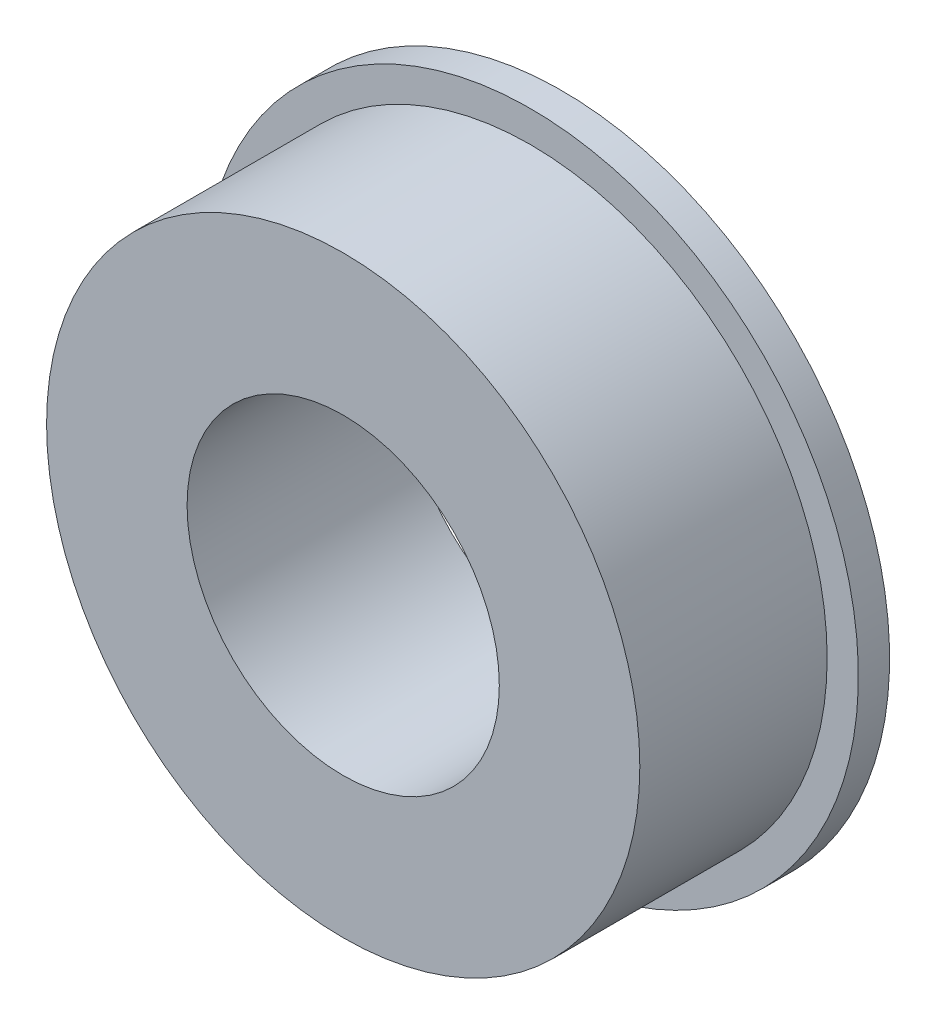
ISO-10303-21;
HEADER;
FILE_DESCRIPTION(('STEP AP214'),'2;1');
FILE_NAME('part.step','',(''),(''),'','','');
FILE_SCHEMA(('AUTOMOTIVE_DESIGN { 1 0 10303 214 1 1 1 1 }'));
ENDSEC;
DATA;
#1=APPLICATION_CONTEXT('core data for automotive mechanical design processes');
#2=APPLICATION_PROTOCOL_DEFINITION('international standard','automotive_design',2000,#1);
#3=PRODUCT_CONTEXT('',#1,'mechanical');
#4=PRODUCT('Part','Part','',(#3));
#5=PRODUCT_RELATED_PRODUCT_CATEGORY('part','',(#4));
#6=PRODUCT_DEFINITION_FORMATION('','',#4);
#7=PRODUCT_DEFINITION_CONTEXT('part definition',#1,'design');
#8=PRODUCT_DEFINITION('design','',#6,#7);
#9=PRODUCT_DEFINITION_SHAPE('','',#8);
#10=(LENGTH_UNIT() NAMED_UNIT(*) SI_UNIT(.MILLI.,.METRE.));
#11=(NAMED_UNIT(*) PLANE_ANGLE_UNIT() SI_UNIT($,.RADIAN.));
#12=(NAMED_UNIT(*) SI_UNIT($,.STERADIAN.) SOLID_ANGLE_UNIT());
#13=UNCERTAINTY_MEASURE_WITH_UNIT(LENGTH_MEASURE(1.E-05),#10,'distance_accuracy_value','');
#14=(GEOMETRIC_REPRESENTATION_CONTEXT(3) GLOBAL_UNCERTAINTY_ASSIGNED_CONTEXT((#13)) GLOBAL_UNIT_ASSIGNED_CONTEXT((#10,
#11,#12)) REPRESENTATION_CONTEXT('',''));
#15=CARTESIAN_POINT('',(0.,0.,0.));
#16=DIRECTION('',(0.,0.,1.));
#17=DIRECTION('',(1.,0.,0.));
#18=AXIS2_PLACEMENT_3D('',#15,#16,#17);
#19=CARTESIAN_POINT('',(0.,0.,7.));
#20=DIRECTION('',(0.,0.,-1.));
#21=DIRECTION('',(-1.,0.,0.));
#22=AXIS2_PLACEMENT_3D('',#19,#20,#21);
#23=CYLINDRICAL_SURFACE('',#22,9.5);
#24=CARTESIAN_POINT('',(0.,0.,7.));
#25=DIRECTION('',(0.,0.,1.));
#26=DIRECTION('',(1.,0.,0.));
#27=AXIS2_PLACEMENT_3D('',#24,#25,#26);
#28=CIRCLE('',#27,9.5);
#29=CARTESIAN_POINT('',(9.5,0.,7.));
#30=VERTEX_POINT('',#29);
#31=EDGE_CURVE('E39',#30,#30,#28,.T.);
#32=ORIENTED_EDGE('',*,*,#31,.F.);
#33=EDGE_LOOP('',(#32));
#34=FACE_BOUND('',#33,.T.);
#35=CARTESIAN_POINT('',(0.,0.,1.));
#36=DIRECTION('',(0.,0.,-1.));
#37=DIRECTION('',(-1.,0.,0.));
#38=AXIS2_PLACEMENT_3D('',#35,#36,#37);
#39=CIRCLE('',#38,9.5);
#40=CARTESIAN_POINT('',(-9.5,0.,1.));
#41=VERTEX_POINT('',#40);
#42=EDGE_CURVE('E10',#41,#41,#39,.T.);
#43=ORIENTED_EDGE('',*,*,#42,.F.);
#44=EDGE_LOOP('',(#43));
#45=FACE_BOUND('',#44,.T.);
#46=ADVANCED_FACE('F33',(#34,#45),#23,.T.);
#47=CARTESIAN_POINT('',(0.,0.,7.));
#48=DIRECTION('',(0.,0.,1.));
#49=DIRECTION('',(1.,0.,0.));
#50=AXIS2_PLACEMENT_3D('',#47,#48,#49);
#51=PLANE('',#50);
#52=ORIENTED_EDGE('',*,*,#31,.T.);
#53=EDGE_LOOP('',(#52));
#54=FACE_BOUND('',#53,.T.);
#55=CARTESIAN_POINT('',(0.,0.,7.));
#56=DIRECTION('',(0.,0.,1.));
#57=DIRECTION('',(1.,0.,0.));
#58=AXIS2_PLACEMENT_3D('',#55,#56,#57);
#59=CIRCLE('',#58,5.);
#60=CARTESIAN_POINT('',(5.,0.,7.));
#61=VERTEX_POINT('',#60);
#62=EDGE_CURVE('E43',#61,#61,#59,.T.);
#63=ORIENTED_EDGE('',*,*,#62,.F.);
#64=EDGE_LOOP('',(#63));
#65=FACE_BOUND('',#64,.T.);
#66=ADVANCED_FACE('F71',(#54,#65),#51,.T.);
#67=CARTESIAN_POINT('',(0.,0.,0.));
#68=DIRECTION('',(0.,0.,1.));
#69=DIRECTION('',(1.,0.,0.));
#70=AXIS2_PLACEMENT_3D('',#67,#68,#69);
#71=PLANE('',#70);
#72=CARTESIAN_POINT('',(0.,0.,0.));
#73=DIRECTION('',(0.,0.,1.));
#74=DIRECTION('',(1.,0.,0.));
#75=AXIS2_PLACEMENT_3D('',#72,#73,#74);
#76=CIRCLE('',#75,5.);
#77=CARTESIAN_POINT('',(5.,0.,0.));
#78=VERTEX_POINT('',#77);
#79=EDGE_CURVE('E47',#78,#78,#76,.T.);
#80=ORIENTED_EDGE('',*,*,#79,.T.);
#81=EDGE_LOOP('',(#80));
#82=FACE_BOUND('',#81,.T.);
#83=CARTESIAN_POINT('',(0.,0.,0.));
#84=DIRECTION('',(0.,0.,-1.));
#85=DIRECTION('',(-1.,0.,0.));
#86=AXIS2_PLACEMENT_3D('',#83,#84,#85);
#87=CIRCLE('',#86,10.5);
#88=CARTESIAN_POINT('',(-10.5,0.,0.));
#89=VERTEX_POINT('',#88);
#90=EDGE_CURVE('E53',#89,#89,#87,.T.);
#91=ORIENTED_EDGE('',*,*,#90,.T.);
#92=EDGE_LOOP('',(#91));
#93=FACE_BOUND('',#92,.T.);
#94=ADVANCED_FACE('F76',(#82,#93),#71,.F.);
#95=CARTESIAN_POINT('',(0.,0.,7.));
#96=DIRECTION('',(0.,0.,-1.));
#97=DIRECTION('',(-1.,0.,0.));
#98=AXIS2_PLACEMENT_3D('',#95,#96,#97);
#99=CYLINDRICAL_SURFACE('',#98,5.);
#100=ORIENTED_EDGE('',*,*,#62,.T.);
#101=EDGE_LOOP('',(#100));
#102=FACE_BOUND('',#101,.T.);
#103=ORIENTED_EDGE('',*,*,#79,.F.);
#104=EDGE_LOOP('',(#103));
#105=FACE_BOUND('',#104,.T.);
#106=ADVANCED_FACE('F68',(#102,#105),#99,.F.);
#107=CARTESIAN_POINT('',(0.,0.,1.));
#108=DIRECTION('',(0.,0.,-1.));
#109=DIRECTION('',(-1.,0.,0.));
#110=AXIS2_PLACEMENT_3D('',#107,#108,#109);
#111=CYLINDRICAL_SURFACE('',#110,10.5);
#112=CARTESIAN_POINT('',(0.,0.,1.));
#113=DIRECTION('',(0.,0.,-1.));
#114=DIRECTION('',(-1.,0.,0.));
#115=AXIS2_PLACEMENT_3D('',#112,#113,#114);
#116=CIRCLE('',#115,10.5);
#117=CARTESIAN_POINT('',(-10.5,0.,1.));
#118=VERTEX_POINT('',#117);
#119=EDGE_CURVE('E51',#118,#118,#116,.T.);
#120=ORIENTED_EDGE('',*,*,#119,.T.);
#121=EDGE_LOOP('',(#120));
#122=FACE_BOUND('',#121,.T.);
#123=ORIENTED_EDGE('',*,*,#90,.F.);
#124=EDGE_LOOP('',(#123));
#125=FACE_BOUND('',#124,.T.);
#126=ADVANCED_FACE('F59',(#122,#125),#111,.T.);
#127=CARTESIAN_POINT('',(0.,0.,1.));
#128=DIRECTION('',(0.,0.,-1.));
#129=DIRECTION('',(-1.,0.,0.));
#130=AXIS2_PLACEMENT_3D('',#127,#128,#129);
#131=PLANE('',#130);
#132=ORIENTED_EDGE('',*,*,#42,.T.);
#133=EDGE_LOOP('',(#132));
#134=FACE_BOUND('',#133,.T.);
#135=ORIENTED_EDGE('',*,*,#119,.F.);
#136=EDGE_LOOP('',(#135));
#137=FACE_BOUND('',#136,.T.);
#138=ADVANCED_FACE('F62',(#134,#137),#131,.F.);
#139=CLOSED_SHELL('',(#46,#66,#94,#106,#126,#138));
#140=MANIFOLD_SOLID_BREP('B2',#139);
#141=ADVANCED_BREP_SHAPE_REPRESENTATION('',(#18,#140),#14);
#142=SHAPE_DEFINITION_REPRESENTATION(#9,#141);
ENDSEC;
END-ISO-10303-21;
